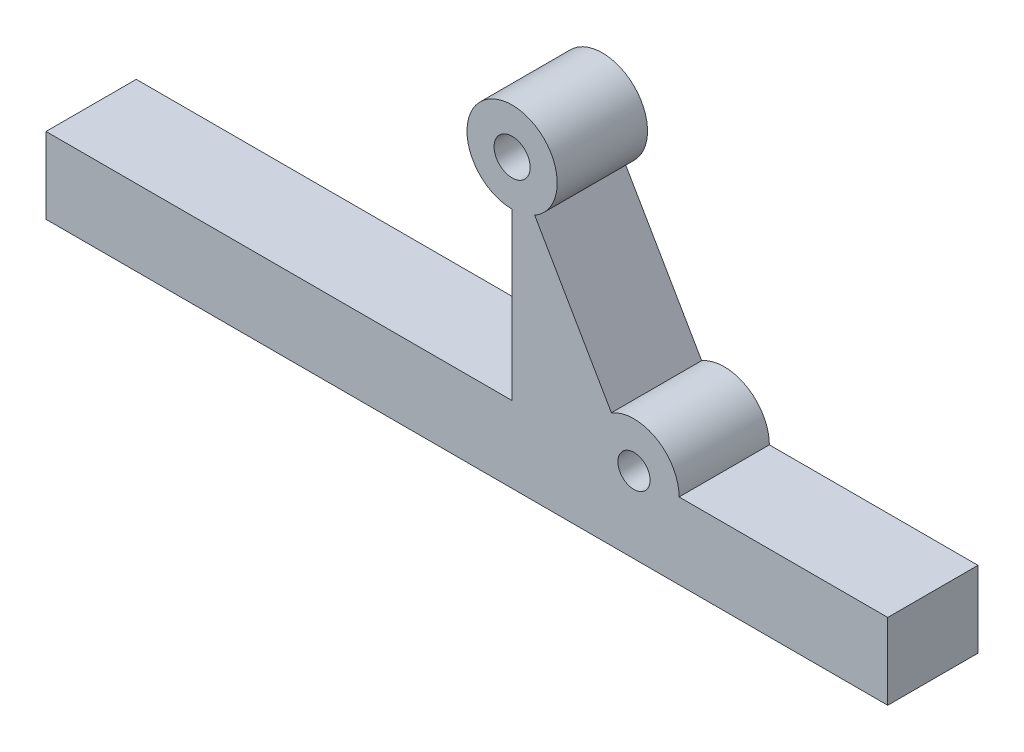
ISO-10303-21;
HEADER;
FILE_DESCRIPTION(('STEP AP214'),'2;1');
FILE_NAME('part.step','',(''),(''),'','','');
FILE_SCHEMA(('AUTOMOTIVE_DESIGN { 1 0 10303 214 1 1 1 1 }'));
ENDSEC;
DATA;
#1=APPLICATION_CONTEXT('core data for automotive mechanical design processes');
#2=APPLICATION_PROTOCOL_DEFINITION('international standard','automotive_design',2000,#1);
#3=PRODUCT_CONTEXT('',#1,'mechanical');
#4=PRODUCT('Part','Part','',(#3));
#5=PRODUCT_RELATED_PRODUCT_CATEGORY('part','',(#4));
#6=PRODUCT_DEFINITION_FORMATION('','',#4);
#7=PRODUCT_DEFINITION_CONTEXT('part definition',#1,'design');
#8=PRODUCT_DEFINITION('design','',#6,#7);
#9=PRODUCT_DEFINITION_SHAPE('','',#8);
#10=(LENGTH_UNIT() NAMED_UNIT(*) SI_UNIT(.MILLI.,.METRE.));
#11=(NAMED_UNIT(*) PLANE_ANGLE_UNIT() SI_UNIT($,.RADIAN.));
#12=(NAMED_UNIT(*) SI_UNIT($,.STERADIAN.) SOLID_ANGLE_UNIT());
#13=UNCERTAINTY_MEASURE_WITH_UNIT(LENGTH_MEASURE(1.E-05),#10,'distance_accuracy_value','');
#14=(GEOMETRIC_REPRESENTATION_CONTEXT(3) GLOBAL_UNCERTAINTY_ASSIGNED_CONTEXT((#13)) GLOBAL_UNIT_ASSIGNED_CONTEXT((#10,
#11,#12)) REPRESENTATION_CONTEXT('',''));
#15=CARTESIAN_POINT('',(0.,0.,0.));
#16=DIRECTION('',(0.,0.,1.));
#17=DIRECTION('',(1.,0.,0.));
#18=AXIS2_PLACEMENT_3D('',#15,#16,#17);
#19=CARTESIAN_POINT('',(0.,0.,5.));
#20=DIRECTION('',(0.,1.,0.));
#21=DIRECTION('',(0.,0.,1.));
#22=AXIS2_PLACEMENT_3D('',#19,#20,#21);
#23=PLANE('',#22);
#24=DIRECTION('',(1.,0.,0.));
#25=VECTOR('',#24,1.);
#26=CARTESIAN_POINT('',(0.,0.,-5.));
#27=LINE('',#26,#25);
#28=CARTESIAN_POINT('',(18.5,0.,-5.));
#29=VERTEX_POINT('',#28);
#30=CARTESIAN_POINT('',(41.6122161944946,0.,-5.));
#31=VERTEX_POINT('',#30);
#32=EDGE_CURVE('E152',#29,#31,#27,.T.);
#33=ORIENTED_EDGE('',*,*,#32,.F.);
#34=DIRECTION('',(0.,0.,-1.));
#35=VECTOR('',#34,1.);
#36=CARTESIAN_POINT('',(18.5,0.,5.));
#37=LINE('',#36,#35);
#38=CARTESIAN_POINT('',(18.5,0.,5.));
#39=VERTEX_POINT('',#38);
#40=EDGE_CURVE('E11',#39,#29,#37,.T.);
#41=ORIENTED_EDGE('',*,*,#40,.F.);
#42=DIRECTION('',(1.,0.,0.));
#43=VECTOR('',#42,1.);
#44=CARTESIAN_POINT('',(0.,0.,5.));
#45=LINE('',#44,#43);
#46=CARTESIAN_POINT('',(41.6122161944946,0.,5.));
#47=VERTEX_POINT('',#46);
#48=EDGE_CURVE('E352',#39,#47,#45,.T.);
#49=ORIENTED_EDGE('',*,*,#48,.T.);
#50=DIRECTION('',(0.,0.,-1.));
#51=VECTOR('',#50,1.);
#52=CARTESIAN_POINT('',(41.6122161944946,0.,5.));
#53=LINE('',#52,#51);
#54=EDGE_CURVE('E57',#47,#31,#53,.T.);
#55=ORIENTED_EDGE('',*,*,#54,.T.);
#56=EDGE_LOOP('',(#33,#41,#49,#55));
#57=FACE_BOUND('',#56,.T.);
#58=ADVANCED_FACE('F39',(#57),#23,.T.);
#59=CARTESIAN_POINT('',(13.5,0.,5.));
#60=DIRECTION('',(0.,0.,-1.));
#61=DIRECTION('',(-1.,0.,0.));
#62=AXIS2_PLACEMENT_3D('',#59,#60,#61);
#63=CYLINDRICAL_SURFACE('',#62,5.);
#64=CARTESIAN_POINT('',(13.5,0.,-5.));
#65=DIRECTION('',(0.,0.,1.));
#66=DIRECTION('',(1.,0.,0.));
#67=AXIS2_PLACEMENT_3D('',#64,#65,#66);
#68=CIRCLE('',#67,5.);
#69=CARTESIAN_POINT('',(10.9981797698153,4.32907559830484,-5.));
#70=VERTEX_POINT('',#69);
#71=EDGE_CURVE('E155',#29,#70,#68,.T.);
#72=ORIENTED_EDGE('',*,*,#71,.T.);
#73=DIRECTION('',(0.,0.,-1.));
#74=VECTOR('',#73,1.);
#75=CARTESIAN_POINT('',(10.9981797698153,4.32907559830484,5.));
#76=LINE('',#75,#74);
#77=CARTESIAN_POINT('',(10.9981797698153,4.32907559830484,5.));
#78=VERTEX_POINT('',#77);
#79=EDGE_CURVE('E49',#78,#70,#76,.T.);
#80=ORIENTED_EDGE('',*,*,#79,.F.);
#81=CARTESIAN_POINT('',(13.5,0.,5.));
#82=DIRECTION('',(0.,0.,1.));
#83=DIRECTION('',(1.,0.,0.));
#84=AXIS2_PLACEMENT_3D('',#81,#82,#83);
#85=CIRCLE('',#84,5.);
#86=EDGE_CURVE('E346',#39,#78,#85,.T.);
#87=ORIENTED_EDGE('',*,*,#86,.F.);
#88=ORIENTED_EDGE('',*,*,#40,.T.);
#89=EDGE_LOOP('',(#72,#80,#87,#88));
#90=FACE_BOUND('',#89,.T.);
#91=ADVANCED_FACE('F212',(#90),#63,.T.);
#92=CARTESIAN_POINT('',(10.1200835893527,5.84850721131258,5.));
#93=DIRECTION('',(-0.865815119660968,-0.500364046036946,0.));
#94=DIRECTION('',(0.500364046036946,-0.865815119660968,0.));
#95=AXIS2_PLACEMENT_3D('',#92,#93,#94);
#96=PLANE('',#95);
#97=DIRECTION('',(-0.500364046036946,0.865815119660968,0.));
#98=VECTOR('',#97,1.);
#99=CARTESIAN_POINT('',(10.1200835893527,5.84850721131258,-5.));
#100=LINE('',#99,#98);
#101=CARTESIAN_POINT('',(2.50182023018473,19.0309244016952,-5.));
#102=VERTEX_POINT('',#101);
#103=EDGE_CURVE('E159',#70,#102,#100,.T.);
#104=ORIENTED_EDGE('',*,*,#103,.T.);
#105=DIRECTION('',(0.,0.,-1.));
#106=VECTOR('',#105,1.);
#107=CARTESIAN_POINT('',(2.50182023018473,19.0309244016952,5.));
#108=LINE('',#107,#106);
#109=CARTESIAN_POINT('',(2.50182023018473,19.0309244016952,5.));
#110=VERTEX_POINT('',#109);
#111=EDGE_CURVE('E198',#110,#102,#108,.T.);
#112=ORIENTED_EDGE('',*,*,#111,.F.);
#113=DIRECTION('',(-0.500364046036946,0.865815119660968,0.));
#114=VECTOR('',#113,1.);
#115=CARTESIAN_POINT('',(10.1200835893527,5.84850721131258,5.));
#116=LINE('',#115,#114);
#117=EDGE_CURVE('E208',#78,#110,#116,.T.);
#118=ORIENTED_EDGE('',*,*,#117,.F.);
#119=ORIENTED_EDGE('',*,*,#79,.T.);
#120=EDGE_LOOP('',(#104,#112,#118,#119));
#121=FACE_BOUND('',#120,.T.);
#122=ADVANCED_FACE('F205',(#121),#96,.F.);
#123=CARTESIAN_POINT('',(0.,23.36,5.));
#124=DIRECTION('',(0.,0.,-1.));
#125=DIRECTION('',(-1.,0.,0.));
#126=AXIS2_PLACEMENT_3D('',#123,#124,#125);
#127=CYLINDRICAL_SURFACE('',#126,5.);
#128=CARTESIAN_POINT('',(0.,23.36,-5.));
#129=DIRECTION('',(0.,0.,1.));
#130=DIRECTION('',(1.,0.,0.));
#131=AXIS2_PLACEMENT_3D('',#128,#129,#130);
#132=CIRCLE('',#131,5.);
#133=CARTESIAN_POINT('',(0.,18.36,-5.));
#134=VERTEX_POINT('',#133);
#135=EDGE_CURVE('E163',#102,#134,#132,.T.);
#136=ORIENTED_EDGE('',*,*,#135,.T.);
#137=DIRECTION('',(0.,0.,-1.));
#138=VECTOR('',#137,1.);
#139=CARTESIAN_POINT('',(0.,18.36,5.));
#140=LINE('',#139,#138);
#141=CARTESIAN_POINT('',(0.,18.36,5.));
#142=VERTEX_POINT('',#141);
#143=EDGE_CURVE('E194',#142,#134,#140,.T.);
#144=ORIENTED_EDGE('',*,*,#143,.F.);
#145=CARTESIAN_POINT('',(0.,23.36,5.));
#146=DIRECTION('',(0.,0.,1.));
#147=DIRECTION('',(1.,0.,0.));
#148=AXIS2_PLACEMENT_3D('',#145,#146,#147);
#149=CIRCLE('',#148,5.);
#150=EDGE_CURVE('E341',#110,#142,#149,.T.);
#151=ORIENTED_EDGE('',*,*,#150,.F.);
#152=ORIENTED_EDGE('',*,*,#111,.T.);
#153=EDGE_LOOP('',(#136,#144,#151,#152));
#154=FACE_BOUND('',#153,.T.);
#155=ADVANCED_FACE('F258',(#154),#127,.T.);
#156=CARTESIAN_POINT('',(0.,0.,5.));
#157=DIRECTION('',(1.,0.,0.));
#158=DIRECTION('',(0.,0.,-1.));
#159=AXIS2_PLACEMENT_3D('',#156,#157,#158);
#160=PLANE('',#159);
#161=DIRECTION('',(0.,-1.,0.));
#162=VECTOR('',#161,1.);
#163=CARTESIAN_POINT('',(0.,0.,-5.));
#164=LINE('',#163,#162);
#165=CARTESIAN_POINT('',(0.,0.,-5.));
#166=VERTEX_POINT('',#165);
#167=EDGE_CURVE('E167',#134,#166,#164,.T.);
#168=ORIENTED_EDGE('',*,*,#167,.T.);
#169=DIRECTION('',(0.,0.,-1.));
#170=VECTOR('',#169,1.);
#171=CARTESIAN_POINT('',(0.,0.,5.));
#172=LINE('',#171,#170);
#173=CARTESIAN_POINT('',(0.,0.,5.));
#174=VERTEX_POINT('',#173);
#175=EDGE_CURVE('E191',#174,#166,#172,.T.);
#176=ORIENTED_EDGE('',*,*,#175,.F.);
#177=DIRECTION('',(0.,-1.,0.));
#178=VECTOR('',#177,1.);
#179=CARTESIAN_POINT('',(0.,0.,5.));
#180=LINE('',#179,#178);
#181=EDGE_CURVE('E338',#142,#174,#180,.T.);
#182=ORIENTED_EDGE('',*,*,#181,.F.);
#183=ORIENTED_EDGE('',*,*,#143,.T.);
#184=EDGE_LOOP('',(#168,#176,#182,#183));
#185=FACE_BOUND('',#184,.T.);
#186=ADVANCED_FACE('F254',(#185),#160,.F.);
#187=CARTESIAN_POINT('',(0.,0.,5.));
#188=DIRECTION('',(0.,1.,0.));
#189=DIRECTION('',(0.,0.,1.));
#190=AXIS2_PLACEMENT_3D('',#187,#188,#189);
#191=PLANE('',#190);
#192=DIRECTION('',(1.,0.,0.));
#193=VECTOR('',#192,1.);
#194=CARTESIAN_POINT('',(0.,0.,-5.));
#195=LINE('',#194,#193);
#196=CARTESIAN_POINT('',(-51.636977368623,0.,-5.));
#197=VERTEX_POINT('',#196);
#198=EDGE_CURVE('E171',#197,#166,#195,.T.);
#199=ORIENTED_EDGE('',*,*,#198,.F.);
#200=DIRECTION('',(0.,0.,-1.));
#201=VECTOR('',#200,1.);
#202=CARTESIAN_POINT('',(-51.636977368623,0.,5.));
#203=LINE('',#202,#201);
#204=CARTESIAN_POINT('',(-51.636977368623,0.,5.));
#205=VERTEX_POINT('',#204);
#206=EDGE_CURVE('E123',#205,#197,#203,.T.);
#207=ORIENTED_EDGE('',*,*,#206,.F.);
#208=DIRECTION('',(1.,0.,0.));
#209=VECTOR('',#208,1.);
#210=CARTESIAN_POINT('',(0.,0.,5.));
#211=LINE('',#210,#209);
#212=EDGE_CURVE('E133',#205,#174,#211,.T.);
#213=ORIENTED_EDGE('',*,*,#212,.T.);
#214=ORIENTED_EDGE('',*,*,#175,.T.);
#215=EDGE_LOOP('',(#199,#207,#213,#214));
#216=FACE_BOUND('',#215,.T.);
#217=ADVANCED_FACE('F251',(#216),#191,.T.);
#218=CARTESIAN_POINT('',(-51.636977368623,0.,5.));
#219=DIRECTION('',(-1.,0.,0.));
#220=DIRECTION('',(0.,0.,1.));
#221=AXIS2_PLACEMENT_3D('',#218,#219,#220);
#222=PLANE('',#221);
#223=DIRECTION('',(0.,1.,0.));
#224=VECTOR('',#223,1.);
#225=CARTESIAN_POINT('',(-51.636977368623,0.,-5.));
#226=LINE('',#225,#224);
#227=CARTESIAN_POINT('',(-51.636977368623,-8.43084187261402,-5.));
#228=VERTEX_POINT('',#227);
#229=EDGE_CURVE('E118',#228,#197,#226,.T.);
#230=ORIENTED_EDGE('',*,*,#229,.F.);
#231=DIRECTION('',(0.,0.,-1.));
#232=VECTOR('',#231,1.);
#233=CARTESIAN_POINT('',(-51.636977368623,-8.43084187261402,5.));
#234=LINE('',#233,#232);
#235=CARTESIAN_POINT('',(-51.636977368623,-8.43084187261402,5.));
#236=VERTEX_POINT('',#235);
#237=EDGE_CURVE('E113',#236,#228,#234,.T.);
#238=ORIENTED_EDGE('',*,*,#237,.F.);
#239=DIRECTION('',(0.,1.,0.));
#240=VECTOR('',#239,1.);
#241=CARTESIAN_POINT('',(-51.636977368623,0.,5.));
#242=LINE('',#241,#240);
#243=EDGE_CURVE('E116',#236,#205,#242,.T.);
#244=ORIENTED_EDGE('',*,*,#243,.T.);
#245=ORIENTED_EDGE('',*,*,#206,.T.);
#246=EDGE_LOOP('',(#230,#238,#244,#245));
#247=FACE_BOUND('',#246,.T.);
#248=ADVANCED_FACE('F115',(#247),#222,.T.);
#249=CARTESIAN_POINT('',(0.,-8.43084187261402,5.));
#250=DIRECTION('',(0.,-1.,0.));
#251=DIRECTION('',(0.,0.,-1.));
#252=AXIS2_PLACEMENT_3D('',#249,#250,#251);
#253=PLANE('',#252);
#254=DIRECTION('',(-1.,0.,0.));
#255=VECTOR('',#254,1.);
#256=CARTESIAN_POINT('',(0.,-8.43084187261402,-5.));
#257=LINE('',#256,#255);
#258=CARTESIAN_POINT('',(41.6122161944946,-8.43084187261402,-5.));
#259=VERTEX_POINT('',#258);
#260=EDGE_CURVE('E177',#259,#228,#257,.T.);
#261=ORIENTED_EDGE('',*,*,#260,.F.);
#262=DIRECTION('',(0.,0.,-1.));
#263=VECTOR('',#262,1.);
#264=CARTESIAN_POINT('',(41.6122161944946,-8.43084187261402,5.));
#265=LINE('',#264,#263);
#266=CARTESIAN_POINT('',(41.6122161944946,-8.43084187261402,5.));
#267=VERTEX_POINT('',#266);
#268=EDGE_CURVE('E85',#267,#259,#265,.T.);
#269=ORIENTED_EDGE('',*,*,#268,.F.);
#270=DIRECTION('',(-1.,0.,0.));
#271=VECTOR('',#270,1.);
#272=CARTESIAN_POINT('',(0.,-8.43084187261402,5.));
#273=LINE('',#272,#271);
#274=EDGE_CURVE('E131',#267,#236,#273,.T.);
#275=ORIENTED_EDGE('',*,*,#274,.T.);
#276=ORIENTED_EDGE('',*,*,#237,.T.);
#277=EDGE_LOOP('',(#261,#269,#275,#276));
#278=FACE_BOUND('',#277,.T.);
#279=ADVANCED_FACE('F136',(#278),#253,.T.);
#280=CARTESIAN_POINT('',(0.,23.36,5.));
#281=DIRECTION('',(0.,0.,-1.));
#282=DIRECTION('',(-1.,0.,0.));
#283=AXIS2_PLACEMENT_3D('',#280,#281,#282);
#284=CYLINDRICAL_SURFACE('',#283,2.);
#285=CARTESIAN_POINT('',(0.,23.36,5.));
#286=DIRECTION('',(0.,0.,1.));
#287=DIRECTION('',(1.,0.,0.));
#288=AXIS2_PLACEMENT_3D('',#285,#286,#287);
#289=CIRCLE('',#288,2.);
#290=CARTESIAN_POINT('',(2.,23.36,5.));
#291=VERTEX_POINT('',#290);
#292=EDGE_CURVE('E235',#291,#291,#289,.T.);
#293=ORIENTED_EDGE('',*,*,#292,.T.);
#294=EDGE_LOOP('',(#293));
#295=FACE_BOUND('',#294,.T.);
#296=CARTESIAN_POINT('',(0.,23.36,-5.));
#297=DIRECTION('',(0.,0.,1.));
#298=DIRECTION('',(1.,0.,0.));
#299=AXIS2_PLACEMENT_3D('',#296,#297,#298);
#300=CIRCLE('',#299,2.);
#301=CARTESIAN_POINT('',(2.,23.36,-5.));
#302=VERTEX_POINT('',#301);
#303=EDGE_CURVE('E148',#302,#302,#300,.T.);
#304=ORIENTED_EDGE('',*,*,#303,.F.);
#305=EDGE_LOOP('',(#304));
#306=FACE_BOUND('',#305,.T.);
#307=ADVANCED_FACE('F222',(#295,#306),#284,.F.);
#308=CARTESIAN_POINT('',(13.5,0.,5.));
#309=DIRECTION('',(0.,0.,-1.));
#310=DIRECTION('',(-1.,0.,0.));
#311=AXIS2_PLACEMENT_3D('',#308,#309,#310);
#312=CYLINDRICAL_SURFACE('',#311,1.78075054677316);
#313=CARTESIAN_POINT('',(13.5,0.,5.));
#314=DIRECTION('',(0.,0.,1.));
#315=DIRECTION('',(1.,0.,0.));
#316=AXIS2_PLACEMENT_3D('',#313,#314,#315);
#317=CIRCLE('',#316,1.78075054677316);
#318=CARTESIAN_POINT('',(15.2807505467732,0.,5.));
#319=VERTEX_POINT('',#318);
#320=EDGE_CURVE('E184',#319,#319,#317,.T.);
#321=ORIENTED_EDGE('',*,*,#320,.T.);
#322=EDGE_LOOP('',(#321));
#323=FACE_BOUND('',#322,.T.);
#324=CARTESIAN_POINT('',(13.5,0.,-5.));
#325=DIRECTION('',(0.,0.,1.));
#326=DIRECTION('',(1.,0.,0.));
#327=AXIS2_PLACEMENT_3D('',#324,#325,#326);
#328=CIRCLE('',#327,1.78075054677316);
#329=CARTESIAN_POINT('',(15.2807505467732,0.,-5.));
#330=VERTEX_POINT('',#329);
#331=EDGE_CURVE('E144',#330,#330,#328,.T.);
#332=ORIENTED_EDGE('',*,*,#331,.F.);
#333=EDGE_LOOP('',(#332));
#334=FACE_BOUND('',#333,.T.);
#335=ADVANCED_FACE('F41',(#323,#334),#312,.F.);
#336=CARTESIAN_POINT('',(41.6122161944946,0.,5.));
#337=DIRECTION('',(1.,0.,0.));
#338=DIRECTION('',(0.,0.,-1.));
#339=AXIS2_PLACEMENT_3D('',#336,#337,#338);
#340=PLANE('',#339);
#341=DIRECTION('',(0.,-1.,0.));
#342=VECTOR('',#341,1.);
#343=CARTESIAN_POINT('',(41.6122161944946,0.,-5.));
#344=LINE('',#343,#342);
#345=EDGE_CURVE('E180',#31,#259,#344,.T.);
#346=ORIENTED_EDGE('',*,*,#345,.F.);
#347=ORIENTED_EDGE('',*,*,#54,.F.);
#348=DIRECTION('',(0.,-1.,0.));
#349=VECTOR('',#348,1.);
#350=CARTESIAN_POINT('',(41.6122161944946,0.,5.));
#351=LINE('',#350,#349);
#352=EDGE_CURVE('E138',#47,#267,#351,.T.);
#353=ORIENTED_EDGE('',*,*,#352,.T.);
#354=ORIENTED_EDGE('',*,*,#268,.T.);
#355=EDGE_LOOP('',(#346,#347,#353,#354));
#356=FACE_BOUND('',#355,.T.);
#357=ADVANCED_FACE('F229',(#356),#340,.T.);
#358=CARTESIAN_POINT('',(0.,0.,5.));
#359=DIRECTION('',(0.,0.,1.));
#360=DIRECTION('',(1.,0.,0.));
#361=AXIS2_PLACEMENT_3D('',#358,#359,#360);
#362=PLANE('',#361);
#363=ORIENTED_EDGE('',*,*,#320,.F.);
#364=EDGE_LOOP('',(#363));
#365=FACE_BOUND('',#364,.T.);
#366=ORIENTED_EDGE('',*,*,#292,.F.);
#367=EDGE_LOOP('',(#366));
#368=FACE_BOUND('',#367,.T.);
#369=ORIENTED_EDGE('',*,*,#48,.F.);
#370=ORIENTED_EDGE('',*,*,#86,.T.);
#371=ORIENTED_EDGE('',*,*,#117,.T.);
#372=ORIENTED_EDGE('',*,*,#150,.T.);
#373=ORIENTED_EDGE('',*,*,#181,.T.);
#374=ORIENTED_EDGE('',*,*,#212,.F.);
#375=ORIENTED_EDGE('',*,*,#243,.F.);
#376=ORIENTED_EDGE('',*,*,#274,.F.);
#377=ORIENTED_EDGE('',*,*,#352,.F.);
#378=EDGE_LOOP('',(#369,#370,#371,#372,#373,#374,#375,#376,#377));
#379=FACE_BOUND('',#378,.T.);
#380=ADVANCED_FACE('F129',(#365,#368,#379),#362,.T.);
#381=CARTESIAN_POINT('',(0.,0.,-5.));
#382=DIRECTION('',(0.,0.,1.));
#383=DIRECTION('',(1.,0.,0.));
#384=AXIS2_PLACEMENT_3D('',#381,#382,#383);
#385=PLANE('',#384);
#386=ORIENTED_EDGE('',*,*,#331,.T.);
#387=EDGE_LOOP('',(#386));
#388=FACE_BOUND('',#387,.T.);
#389=ORIENTED_EDGE('',*,*,#303,.T.);
#390=EDGE_LOOP('',(#389));
#391=FACE_BOUND('',#390,.T.);
#392=ORIENTED_EDGE('',*,*,#32,.T.);
#393=ORIENTED_EDGE('',*,*,#345,.T.);
#394=ORIENTED_EDGE('',*,*,#260,.T.);
#395=ORIENTED_EDGE('',*,*,#229,.T.);
#396=ORIENTED_EDGE('',*,*,#198,.T.);
#397=ORIENTED_EDGE('',*,*,#167,.F.);
#398=ORIENTED_EDGE('',*,*,#135,.F.);
#399=ORIENTED_EDGE('',*,*,#103,.F.);
#400=ORIENTED_EDGE('',*,*,#71,.F.);
#401=EDGE_LOOP('',(#392,#393,#394,#395,#396,#397,#398,#399,#400));
#402=FACE_BOUND('',#401,.T.);
#403=ADVANCED_FACE('F214',(#388,#391,#402),#385,.F.);
#404=CLOSED_SHELL('',(#58,#91,#122,#155,#186,#217,#248,#279,#307,#335,#357,#380,#403));
#405=MANIFOLD_SOLID_BREP('B2',#404);
#406=ADVANCED_BREP_SHAPE_REPRESENTATION('',(#18,#405),#14);
#407=SHAPE_DEFINITION_REPRESENTATION(#9,#406);
ENDSEC;
END-ISO-10303-21;
